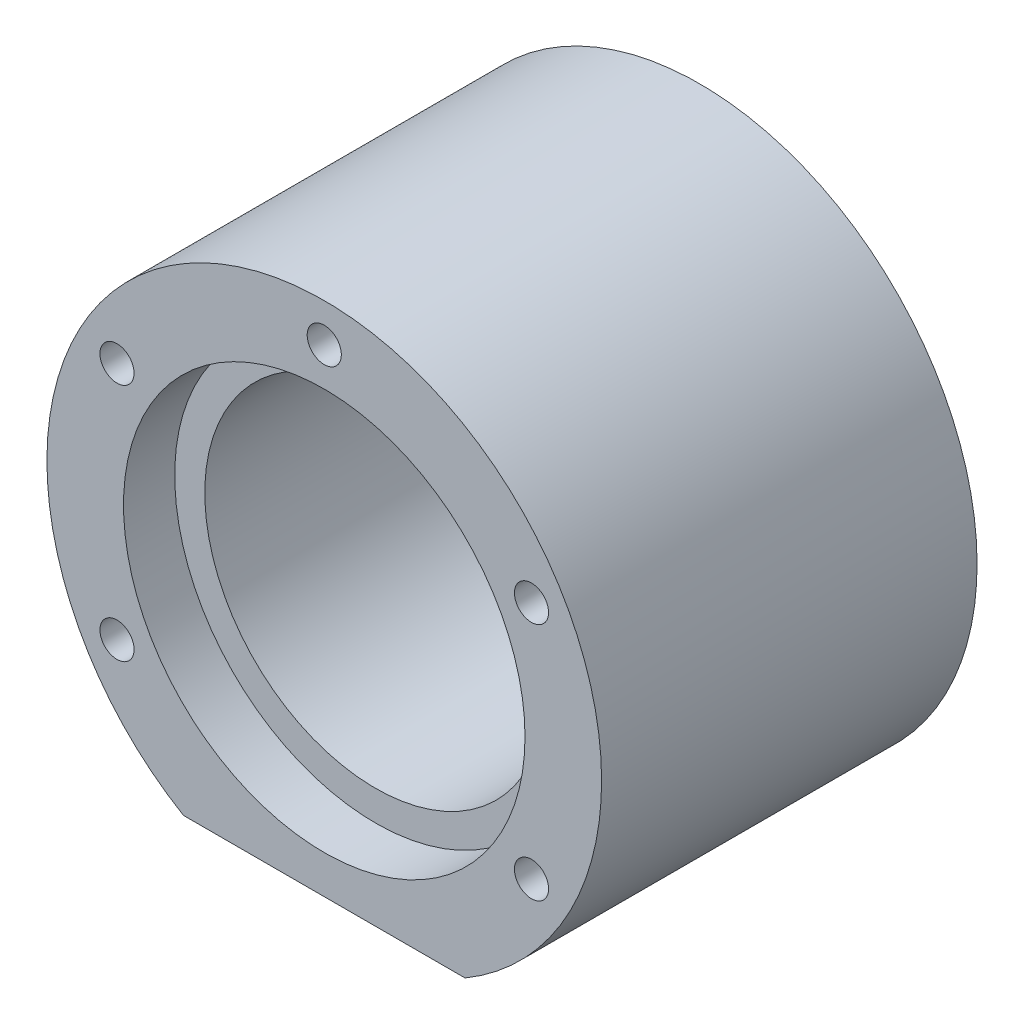
ISO-10303-21;
HEADER;
FILE_DESCRIPTION(('STEP AP214'),'2;1');
FILE_NAME('part.step','',(''),(''),'','','');
FILE_SCHEMA(('AUTOMOTIVE_DESIGN { 1 0 10303 214 1 1 1 1 }'));
ENDSEC;
DATA;
#1=APPLICATION_CONTEXT('core data for automotive mechanical design processes');
#2=APPLICATION_PROTOCOL_DEFINITION('international standard','automotive_design',2000,#1);
#3=PRODUCT_CONTEXT('',#1,'mechanical');
#4=PRODUCT('Part','Part','',(#3));
#5=PRODUCT_RELATED_PRODUCT_CATEGORY('part','',(#4));
#6=PRODUCT_DEFINITION_FORMATION('','',#4);
#7=PRODUCT_DEFINITION_CONTEXT('part definition',#1,'design');
#8=PRODUCT_DEFINITION('design','',#6,#7);
#9=PRODUCT_DEFINITION_SHAPE('','',#8);
#10=(LENGTH_UNIT() NAMED_UNIT(*) SI_UNIT(.MILLI.,.METRE.));
#11=(NAMED_UNIT(*) PLANE_ANGLE_UNIT() SI_UNIT($,.RADIAN.));
#12=(NAMED_UNIT(*) SI_UNIT($,.STERADIAN.) SOLID_ANGLE_UNIT());
#13=UNCERTAINTY_MEASURE_WITH_UNIT(LENGTH_MEASURE(1.E-05),#10,'distance_accuracy_value','');
#14=(GEOMETRIC_REPRESENTATION_CONTEXT(3) GLOBAL_UNCERTAINTY_ASSIGNED_CONTEXT((#13)) GLOBAL_UNIT_ASSIGNED_CONTEXT((#10,
#11,#12)) REPRESENTATION_CONTEXT('',''));
#15=CARTESIAN_POINT('',(0.,0.,0.));
#16=DIRECTION('',(0.,0.,1.));
#17=DIRECTION('',(1.,0.,0.));
#18=AXIS2_PLACEMENT_3D('',#15,#16,#17);
#19=CARTESIAN_POINT('',(0.,0.,44.));
#20=DIRECTION('',(0.,0.,-1.));
#21=DIRECTION('',(-1.,0.,0.));
#22=AXIS2_PLACEMENT_3D('',#19,#20,#21);
#23=CYLINDRICAL_SURFACE('',#22,23.525);
#24=CARTESIAN_POINT('',(0.,0.,0.));
#25=DIRECTION('',(0.,0.,1.));
#26=DIRECTION('',(1.,0.,0.));
#27=AXIS2_PLACEMENT_3D('',#24,#25,#26);
#28=CIRCLE('',#27,23.525);
#29=CARTESIAN_POINT('',(23.525,0.,0.));
#30=VERTEX_POINT('',#29);
#31=EDGE_CURVE('E82',#30,#30,#28,.T.);
#32=ORIENTED_EDGE('',*,*,#31,.F.);
#33=EDGE_LOOP('',(#32));
#34=FACE_BOUND('',#33,.T.);
#35=CARTESIAN_POINT('',(0.,0.,6.));
#36=DIRECTION('',(0.,0.,1.));
#37=DIRECTION('',(1.,0.,0.));
#38=AXIS2_PLACEMENT_3D('',#35,#36,#37);
#39=CIRCLE('',#38,23.525);
#40=CARTESIAN_POINT('',(23.525,0.,6.));
#41=VERTEX_POINT('',#40);
#42=EDGE_CURVE('E42',#41,#41,#39,.T.);
#43=ORIENTED_EDGE('',*,*,#42,.T.);
#44=EDGE_LOOP('',(#43));
#45=FACE_BOUND('',#44,.T.);
#46=ADVANCED_FACE('F38',(#34,#45),#23,.F.);
#47=CARTESIAN_POINT('',(0.,0.,44.));
#48=DIRECTION('',(0.,0.,1.));
#49=DIRECTION('',(1.,0.,0.));
#50=AXIS2_PLACEMENT_3D('',#47,#48,#49);
#51=PLANE('',#50);
#52=CARTESIAN_POINT('',(-24.2860710434224,-14.0647089634405,44.));
#53=DIRECTION('',(0.,0.,1.));
#54=DIRECTION('',(1.,0.,0.));
#55=AXIS2_PLACEMENT_3D('',#52,#53,#54);
#56=CIRCLE('',#55,2.);
#57=CARTESIAN_POINT('',(-22.2860710434224,-14.0647089634405,44.));
#58=VERTEX_POINT('',#57);
#59=EDGE_CURVE('E106',#58,#58,#56,.T.);
#60=ORIENTED_EDGE('',*,*,#59,.F.);
#61=EDGE_LOOP('',(#60));
#62=FACE_BOUND('',#61,.T.);
#63=CARTESIAN_POINT('',(24.2860710434256,13.9784303455217,44.));
#64=DIRECTION('',(0.,0.,1.));
#65=DIRECTION('',(1.,0.,0.));
#66=AXIS2_PLACEMENT_3D('',#63,#64,#65);
#67=CIRCLE('',#66,2.);
#68=CARTESIAN_POINT('',(26.2860710434256,13.9784303455217,44.));
#69=VERTEX_POINT('',#68);
#70=EDGE_CURVE('E94',#69,#69,#67,.T.);
#71=ORIENTED_EDGE('',*,*,#70,.F.);
#72=EDGE_LOOP('',(#71));
#73=FACE_BOUND('',#72,.T.);
#74=CARTESIAN_POINT('',(0.,0.,44.));
#75=DIRECTION('',(0.,0.,1.));
#76=DIRECTION('',(1.,0.,0.));
#77=AXIS2_PLACEMENT_3D('',#74,#75,#76);
#78=CIRCLE('',#77,23.525);
#79=CARTESIAN_POINT('',(23.525,0.,44.));
#80=VERTEX_POINT('',#79);
#81=EDGE_CURVE('E79',#80,#80,#78,.T.);
#82=ORIENTED_EDGE('',*,*,#81,.F.);
#83=EDGE_LOOP('',(#82));
#84=FACE_BOUND('',#83,.T.);
#85=CARTESIAN_POINT('',(0.,0.,44.));
#86=DIRECTION('',(0.,0.,1.));
#87=DIRECTION('',(1.,0.,0.));
#88=AXIS2_PLACEMENT_3D('',#85,#86,#87);
#89=CIRCLE('',#88,32.5);
#90=CARTESIAN_POINT('',(16.5,-28.,44.));
#91=VERTEX_POINT('',#90);
#92=CARTESIAN_POINT('',(-16.5,-28.,44.));
#93=VERTEX_POINT('',#92);
#94=EDGE_CURVE('E72',#91,#93,#89,.T.);
#95=ORIENTED_EDGE('',*,*,#94,.T.);
#96=DIRECTION('',(1.,0.,0.));
#97=VECTOR('',#96,1.);
#98=CARTESIAN_POINT('',(-16.5,-28.,44.));
#99=LINE('',#98,#97);
#100=EDGE_CURVE('E55',#93,#91,#99,.T.);
#101=ORIENTED_EDGE('',*,*,#100,.T.);
#102=EDGE_LOOP('',(#95,#101));
#103=FACE_BOUND('',#102,.T.);
#104=CARTESIAN_POINT('',(0.,28.,44.));
#105=DIRECTION('',(0.,0.,1.));
#106=DIRECTION('',(1.,0.,0.));
#107=AXIS2_PLACEMENT_3D('',#104,#105,#106);
#108=CIRCLE('',#107,2.);
#109=CARTESIAN_POINT('',(2.,28.,44.));
#110=VERTEX_POINT('',#109);
#111=EDGE_CURVE('E89',#110,#110,#108,.T.);
#112=ORIENTED_EDGE('',*,*,#111,.F.);
#113=EDGE_LOOP('',(#112));
#114=FACE_BOUND('',#113,.T.);
#115=CARTESIAN_POINT('',(24.2860710434272,-14.0647089634377,44.));
#116=DIRECTION('',(0.,0.,1.));
#117=DIRECTION('',(1.,0.,0.));
#118=AXIS2_PLACEMENT_3D('',#115,#116,#117);
#119=CIRCLE('',#118,2.);
#120=CARTESIAN_POINT('',(26.2860710434272,-14.0647089634377,44.));
#121=VERTEX_POINT('',#120);
#122=EDGE_CURVE('E100',#121,#121,#119,.T.);
#123=ORIENTED_EDGE('',*,*,#122,.F.);
#124=EDGE_LOOP('',(#123));
#125=FACE_BOUND('',#124,.T.);
#126=CARTESIAN_POINT('',(-24.286071043424,13.9784303455189,44.));
#127=DIRECTION('',(0.,0.,1.));
#128=DIRECTION('',(1.,0.,0.));
#129=AXIS2_PLACEMENT_3D('',#126,#127,#128);
#130=CIRCLE('',#129,2.);
#131=CARTESIAN_POINT('',(-22.286071043424,13.9784303455189,44.));
#132=VERTEX_POINT('',#131);
#133=EDGE_CURVE('E112',#132,#132,#130,.T.);
#134=ORIENTED_EDGE('',*,*,#133,.F.);
#135=EDGE_LOOP('',(#134));
#136=FACE_BOUND('',#135,.T.);
#137=ADVANCED_FACE('F143',(#62,#73,#84,#103,#114,#125,#136),#51,.T.);
#138=CARTESIAN_POINT('',(0.,0.,0.));
#139=DIRECTION('',(0.,0.,1.));
#140=DIRECTION('',(1.,0.,0.));
#141=AXIS2_PLACEMENT_3D('',#138,#139,#140);
#142=PLANE('',#141);
#143=CARTESIAN_POINT('',(0.,0.,0.));
#144=DIRECTION('',(0.,0.,1.));
#145=DIRECTION('',(1.,0.,0.));
#146=AXIS2_PLACEMENT_3D('',#143,#144,#145);
#147=CIRCLE('',#146,32.5);
#148=CARTESIAN_POINT('',(16.5,-28.,0.));
#149=VERTEX_POINT('',#148);
#150=CARTESIAN_POINT('',(-16.5,-28.,0.));
#151=VERTEX_POINT('',#150);
#152=EDGE_CURVE('E73',#149,#151,#147,.T.);
#153=ORIENTED_EDGE('',*,*,#152,.F.);
#154=DIRECTION('',(1.,0.,0.));
#155=VECTOR('',#154,1.);
#156=CARTESIAN_POINT('',(-16.5,-28.,0.));
#157=LINE('',#156,#155);
#158=EDGE_CURVE('E63',#151,#149,#157,.T.);
#159=ORIENTED_EDGE('',*,*,#158,.F.);
#160=EDGE_LOOP('',(#153,#159));
#161=FACE_BOUND('',#160,.T.);
#162=ORIENTED_EDGE('',*,*,#31,.T.);
#163=EDGE_LOOP('',(#162));
#164=FACE_BOUND('',#163,.T.);
#165=CARTESIAN_POINT('',(0.,28.,0.));
#166=DIRECTION('',(0.,0.,1.));
#167=DIRECTION('',(1.,0.,0.));
#168=AXIS2_PLACEMENT_3D('',#165,#166,#167);
#169=CIRCLE('',#168,2.);
#170=CARTESIAN_POINT('',(2.,28.,0.));
#171=VERTEX_POINT('',#170);
#172=EDGE_CURVE('E91',#171,#171,#169,.T.);
#173=ORIENTED_EDGE('',*,*,#172,.T.);
#174=EDGE_LOOP('',(#173));
#175=FACE_BOUND('',#174,.T.);
#176=CARTESIAN_POINT('',(24.2860710434256,13.9784303455217,0.));
#177=DIRECTION('',(0.,0.,1.));
#178=DIRECTION('',(1.,0.,0.));
#179=AXIS2_PLACEMENT_3D('',#176,#177,#178);
#180=CIRCLE('',#179,2.);
#181=CARTESIAN_POINT('',(26.2860710434256,13.9784303455217,0.));
#182=VERTEX_POINT('',#181);
#183=EDGE_CURVE('E97',#182,#182,#180,.T.);
#184=ORIENTED_EDGE('',*,*,#183,.T.);
#185=EDGE_LOOP('',(#184));
#186=FACE_BOUND('',#185,.T.);
#187=CARTESIAN_POINT('',(24.2860710434272,-14.0647089634377,0.));
#188=DIRECTION('',(0.,0.,1.));
#189=DIRECTION('',(1.,0.,0.));
#190=AXIS2_PLACEMENT_3D('',#187,#188,#189);
#191=CIRCLE('',#190,2.);
#192=CARTESIAN_POINT('',(26.2860710434272,-14.0647089634377,0.));
#193=VERTEX_POINT('',#192);
#194=EDGE_CURVE('E103',#193,#193,#191,.T.);
#195=ORIENTED_EDGE('',*,*,#194,.T.);
#196=EDGE_LOOP('',(#195));
#197=FACE_BOUND('',#196,.T.);
#198=CARTESIAN_POINT('',(-24.2860710434224,-14.0647089634405,0.));
#199=DIRECTION('',(0.,0.,1.));
#200=DIRECTION('',(1.,0.,0.));
#201=AXIS2_PLACEMENT_3D('',#198,#199,#200);
#202=CIRCLE('',#201,2.);
#203=CARTESIAN_POINT('',(-22.2860710434224,-14.0647089634405,0.));
#204=VERTEX_POINT('',#203);
#205=EDGE_CURVE('E109',#204,#204,#202,.T.);
#206=ORIENTED_EDGE('',*,*,#205,.T.);
#207=EDGE_LOOP('',(#206));
#208=FACE_BOUND('',#207,.T.);
#209=CARTESIAN_POINT('',(-24.286071043424,13.9784303455189,0.));
#210=DIRECTION('',(0.,0.,1.));
#211=DIRECTION('',(1.,0.,0.));
#212=AXIS2_PLACEMENT_3D('',#209,#210,#211);
#213=CIRCLE('',#212,2.);
#214=CARTESIAN_POINT('',(-22.286071043424,13.9784303455189,0.));
#215=VERTEX_POINT('',#214);
#216=EDGE_CURVE('E115',#215,#215,#213,.T.);
#217=ORIENTED_EDGE('',*,*,#216,.T.);
#218=EDGE_LOOP('',(#217));
#219=FACE_BOUND('',#218,.T.);
#220=ADVANCED_FACE('F77',(#161,#164,#175,#186,#197,#208,#219),#142,.F.);
#221=CARTESIAN_POINT('',(0.,0.,44.));
#222=DIRECTION('',(0.,0.,-1.));
#223=DIRECTION('',(-1.,0.,0.));
#224=AXIS2_PLACEMENT_3D('',#221,#222,#223);
#225=CYLINDRICAL_SURFACE('',#224,32.5);
#226=ORIENTED_EDGE('',*,*,#152,.T.);
#227=DIRECTION('',(0.,0.,-1.));
#228=VECTOR('',#227,1.);
#229=CARTESIAN_POINT('',(-16.5,-28.,44.));
#230=LINE('',#229,#228);
#231=EDGE_CURVE('E48',#93,#151,#230,.T.);
#232=ORIENTED_EDGE('',*,*,#231,.F.);
#233=ORIENTED_EDGE('',*,*,#94,.F.);
#234=DIRECTION('',(0.,0.,-1.));
#235=VECTOR('',#234,1.);
#236=CARTESIAN_POINT('',(16.5,-28.,44.));
#237=LINE('',#236,#235);
#238=EDGE_CURVE('E68',#91,#149,#237,.T.);
#239=ORIENTED_EDGE('',*,*,#238,.T.);
#240=EDGE_LOOP('',(#226,#232,#233,#239));
#241=FACE_BOUND('',#240,.T.);
#242=ADVANCED_FACE('F40',(#241),#225,.T.);
#243=CARTESIAN_POINT('',(-16.5,-28.,44.));
#244=DIRECTION('',(0.,1.,0.));
#245=DIRECTION('',(0.,0.,1.));
#246=AXIS2_PLACEMENT_3D('',#243,#244,#245);
#247=PLANE('',#246);
#248=ORIENTED_EDGE('',*,*,#158,.T.);
#249=ORIENTED_EDGE('',*,*,#238,.F.);
#250=ORIENTED_EDGE('',*,*,#100,.F.);
#251=ORIENTED_EDGE('',*,*,#231,.T.);
#252=EDGE_LOOP('',(#248,#249,#250,#251));
#253=FACE_BOUND('',#252,.T.);
#254=ADVANCED_FACE('F67',(#253),#247,.F.);
#255=CARTESIAN_POINT('',(0.,0.,38.));
#256=DIRECTION('',(0.,0.,1.));
#257=DIRECTION('',(1.,0.,0.));
#258=AXIS2_PLACEMENT_3D('',#255,#256,#257);
#259=CIRCLE('',#258,23.525);
#260=CARTESIAN_POINT('',(23.525,0.,38.));
#261=VERTEX_POINT('',#260);
#262=EDGE_CURVE('E11',#261,#261,#259,.T.);
#263=ORIENTED_EDGE('',*,*,#262,.F.);
#264=EDGE_LOOP('',(#263));
#265=FACE_BOUND('',#264,.T.);
#266=ORIENTED_EDGE('',*,*,#81,.T.);
#267=EDGE_LOOP('',(#266));
#268=FACE_BOUND('',#267,.T.);
#269=ADVANCED_FACE('F136',(#265,#268),#23,.F.);
#270=CARTESIAN_POINT('',(0.,28.,44.));
#271=DIRECTION('',(0.,0.,-1.));
#272=DIRECTION('',(-1.,0.,0.));
#273=AXIS2_PLACEMENT_3D('',#270,#271,#272);
#274=CYLINDRICAL_SURFACE('',#273,2.);
#275=ORIENTED_EDGE('',*,*,#111,.T.);
#276=EDGE_LOOP('',(#275));
#277=FACE_BOUND('',#276,.T.);
#278=ORIENTED_EDGE('',*,*,#172,.F.);
#279=EDGE_LOOP('',(#278));
#280=FACE_BOUND('',#279,.T.);
#281=ADVANCED_FACE('F139',(#277,#280),#274,.F.);
#282=CARTESIAN_POINT('',(24.2860710434256,13.9784303455217,44.));
#283=DIRECTION('',(0.,0.,-1.));
#284=DIRECTION('',(-1.,0.,0.));
#285=AXIS2_PLACEMENT_3D('',#282,#283,#284);
#286=CYLINDRICAL_SURFACE('',#285,2.);
#287=ORIENTED_EDGE('',*,*,#70,.T.);
#288=EDGE_LOOP('',(#287));
#289=FACE_BOUND('',#288,.T.);
#290=ORIENTED_EDGE('',*,*,#183,.F.);
#291=EDGE_LOOP('',(#290));
#292=FACE_BOUND('',#291,.T.);
#293=ADVANCED_FACE('F175',(#289,#292),#286,.F.);
#294=CARTESIAN_POINT('',(24.2860710434272,-14.0647089634377,44.));
#295=DIRECTION('',(0.,0.,-1.));
#296=DIRECTION('',(-1.,0.,0.));
#297=AXIS2_PLACEMENT_3D('',#294,#295,#296);
#298=CYLINDRICAL_SURFACE('',#297,2.);
#299=ORIENTED_EDGE('',*,*,#122,.T.);
#300=EDGE_LOOP('',(#299));
#301=FACE_BOUND('',#300,.T.);
#302=ORIENTED_EDGE('',*,*,#194,.F.);
#303=EDGE_LOOP('',(#302));
#304=FACE_BOUND('',#303,.T.);
#305=ADVANCED_FACE('F179',(#301,#304),#298,.F.);
#306=CARTESIAN_POINT('',(-24.2860710434224,-14.0647089634405,44.));
#307=DIRECTION('',(0.,0.,-1.));
#308=DIRECTION('',(-1.,0.,0.));
#309=AXIS2_PLACEMENT_3D('',#306,#307,#308);
#310=CYLINDRICAL_SURFACE('',#309,2.);
#311=ORIENTED_EDGE('',*,*,#59,.T.);
#312=EDGE_LOOP('',(#311));
#313=FACE_BOUND('',#312,.T.);
#314=ORIENTED_EDGE('',*,*,#205,.F.);
#315=EDGE_LOOP('',(#314));
#316=FACE_BOUND('',#315,.T.);
#317=ADVANCED_FACE('F157',(#313,#316),#310,.F.);
#318=CARTESIAN_POINT('',(-24.286071043424,13.9784303455189,44.));
#319=DIRECTION('',(0.,0.,-1.));
#320=DIRECTION('',(-1.,0.,0.));
#321=AXIS2_PLACEMENT_3D('',#318,#319,#320);
#322=CYLINDRICAL_SURFACE('',#321,2.);
#323=ORIENTED_EDGE('',*,*,#133,.T.);
#324=EDGE_LOOP('',(#323));
#325=FACE_BOUND('',#324,.T.);
#326=ORIENTED_EDGE('',*,*,#216,.F.);
#327=EDGE_LOOP('',(#326));
#328=FACE_BOUND('',#327,.T.);
#329=ADVANCED_FACE('F154',(#325,#328),#322,.F.);
#330=CARTESIAN_POINT('',(0.,0.,6.));
#331=DIRECTION('',(0.,0.,1.));
#332=DIRECTION('',(1.,0.,0.));
#333=AXIS2_PLACEMENT_3D('',#330,#331,#332);
#334=PLANE('',#333);
#335=CARTESIAN_POINT('',(0.,0.,6.));
#336=DIRECTION('',(0.,0.,1.));
#337=DIRECTION('',(1.,0.,0.));
#338=AXIS2_PLACEMENT_3D('',#335,#336,#337);
#339=CIRCLE('',#338,20.);
#340=CARTESIAN_POINT('',(20.,0.,6.));
#341=VERTEX_POINT('',#340);
#342=EDGE_CURVE('E120',#341,#341,#339,.T.);
#343=ORIENTED_EDGE('',*,*,#342,.T.);
#344=EDGE_LOOP('',(#343));
#345=FACE_BOUND('',#344,.T.);
#346=ORIENTED_EDGE('',*,*,#42,.F.);
#347=EDGE_LOOP('',(#346));
#348=FACE_BOUND('',#347,.T.);
#349=ADVANCED_FACE('F132',(#345,#348),#334,.F.);
#350=CARTESIAN_POINT('',(0.,0.,38.));
#351=DIRECTION('',(0.,0.,1.));
#352=DIRECTION('',(1.,0.,0.));
#353=AXIS2_PLACEMENT_3D('',#350,#351,#352);
#354=PLANE('',#353);
#355=CARTESIAN_POINT('',(0.,0.,38.));
#356=DIRECTION('',(0.,0.,1.));
#357=DIRECTION('',(1.,0.,0.));
#358=AXIS2_PLACEMENT_3D('',#355,#356,#357);
#359=CIRCLE('',#358,20.);
#360=CARTESIAN_POINT('',(20.,0.,38.));
#361=VERTEX_POINT('',#360);
#362=EDGE_CURVE('E123',#361,#361,#359,.T.);
#363=ORIENTED_EDGE('',*,*,#362,.F.);
#364=EDGE_LOOP('',(#363));
#365=FACE_BOUND('',#364,.T.);
#366=ORIENTED_EDGE('',*,*,#262,.T.);
#367=EDGE_LOOP('',(#366));
#368=FACE_BOUND('',#367,.T.);
#369=ADVANCED_FACE('F129',(#365,#368),#354,.T.);
#370=CARTESIAN_POINT('',(0.,0.,6.));
#371=DIRECTION('',(0.,0.,1.));
#372=DIRECTION('',(1.,0.,0.));
#373=AXIS2_PLACEMENT_3D('',#370,#371,#372);
#374=CYLINDRICAL_SURFACE('',#373,20.);
#375=ORIENTED_EDGE('',*,*,#342,.F.);
#376=EDGE_LOOP('',(#375));
#377=FACE_BOUND('',#376,.T.);
#378=ORIENTED_EDGE('',*,*,#362,.T.);
#379=EDGE_LOOP('',(#378));
#380=FACE_BOUND('',#379,.T.);
#381=ADVANCED_FACE('F127',(#377,#380),#374,.F.);
#382=CLOSED_SHELL('',(#46,#137,#220,#242,#254,#269,#281,#293,#305,#317,#329,#349,#369,#381));
#383=MANIFOLD_SOLID_BREP('B2',#382);
#384=ADVANCED_BREP_SHAPE_REPRESENTATION('',(#18,#383),#14);
#385=SHAPE_DEFINITION_REPRESENTATION(#9,#384);
ENDSEC;
END-ISO-10303-21;
